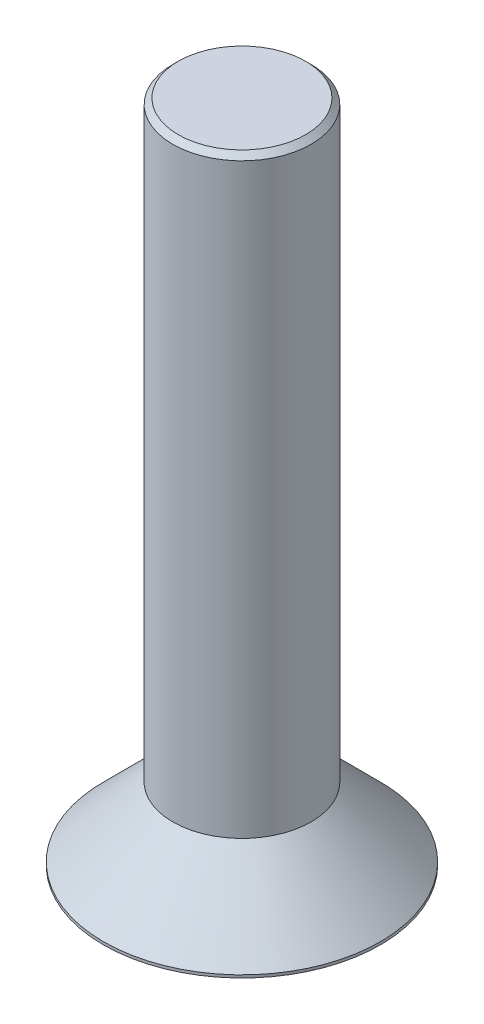
ISO-10303-21;
HEADER;
FILE_DESCRIPTION(('STEP AP214'),'2;1');
FILE_NAME('part.step','',(''),(''),'','','');
FILE_SCHEMA(('AUTOMOTIVE_DESIGN { 1 0 10303 214 1 1 1 1 }'));
ENDSEC;
DATA;
#1=APPLICATION_CONTEXT('core data for automotive mechanical design processes');
#2=APPLICATION_PROTOCOL_DEFINITION('international standard','automotive_design',2000,#1);
#3=PRODUCT_CONTEXT('',#1,'mechanical');
#4=PRODUCT('Part','Part','',(#3));
#5=PRODUCT_RELATED_PRODUCT_CATEGORY('part','',(#4));
#6=PRODUCT_DEFINITION_FORMATION('','',#4);
#7=PRODUCT_DEFINITION_CONTEXT('part definition',#1,'design');
#8=PRODUCT_DEFINITION('design','',#6,#7);
#9=PRODUCT_DEFINITION_SHAPE('','',#8);
#10=(LENGTH_UNIT() NAMED_UNIT(*) SI_UNIT(.MILLI.,.METRE.));
#11=(NAMED_UNIT(*) PLANE_ANGLE_UNIT() SI_UNIT($,.RADIAN.));
#12=(NAMED_UNIT(*) SI_UNIT($,.STERADIAN.) SOLID_ANGLE_UNIT());
#13=UNCERTAINTY_MEASURE_WITH_UNIT(LENGTH_MEASURE(1.E-05),#10,'distance_accuracy_value','');
#14=(GEOMETRIC_REPRESENTATION_CONTEXT(3) GLOBAL_UNCERTAINTY_ASSIGNED_CONTEXT((#13)) GLOBAL_UNIT_ASSIGNED_CONTEXT((#10,
#11,#12)) REPRESENTATION_CONTEXT('',''));
#15=CARTESIAN_POINT('',(0.,0.,0.));
#16=DIRECTION('',(0.,0.,1.));
#17=DIRECTION('',(1.,0.,0.));
#18=AXIS2_PLACEMENT_3D('',#15,#16,#17);
#19=CARTESIAN_POINT('',(0.,2.6,0.));
#20=DIRECTION('',(0.,-1.,0.));
#21=DIRECTION('',(0.,0.,-1.));
#22=AXIS2_PLACEMENT_3D('',#19,#20,#21);
#23=CYLINDRICAL_SURFACE('',#22,5.);
#24=CARTESIAN_POINT('',(0.,0.0999999999999916,0.));
#25=DIRECTION('',(0.,1.,0.));
#26=DIRECTION('',(0.,0.,1.));
#27=AXIS2_PLACEMENT_3D('',#24,#25,#26);
#28=CIRCLE('',#27,5.);
#29=CARTESIAN_POINT('',(0.,0.0999999999999916,5.));
#30=VERTEX_POINT('',#29);
#31=EDGE_CURVE('E151',#30,#30,#28,.F.);
#32=ORIENTED_EDGE('',*,*,#31,.T.);
#33=EDGE_LOOP('',(#32));
#34=FACE_BOUND('',#33,.T.);
#35=CARTESIAN_POINT('',(0.,0.,0.));
#36=DIRECTION('',(0.,1.,0.));
#37=DIRECTION('',(0.,0.,1.));
#38=AXIS2_PLACEMENT_3D('',#35,#36,#37);
#39=CIRCLE('',#38,5.);
#40=CARTESIAN_POINT('',(0.,0.,5.));
#41=VERTEX_POINT('',#40);
#42=EDGE_CURVE('E140',#41,#41,#39,.T.);
#43=ORIENTED_EDGE('',*,*,#42,.T.);
#44=EDGE_LOOP('',(#43));
#45=FACE_BOUND('',#44,.T.);
#46=ADVANCED_FACE('F37',(#34,#45),#23,.T.);
#47=CARTESIAN_POINT('',(0.,0.,0.));
#48=DIRECTION('',(0.,1.,0.));
#49=DIRECTION('',(0.,0.,1.));
#50=AXIS2_PLACEMENT_3D('',#47,#48,#49);
#51=PLANE('',#50);
#52=DIRECTION('',(0.,0.,1.));
#53=VECTOR('',#52,1.);
#54=CARTESIAN_POINT('',(1.54,0.,-0.889119414552024));
#55=LINE('',#54,#53);
#56=CARTESIAN_POINT('',(1.54,0.,-0.889119414552024));
#57=VERTEX_POINT('',#56);
#58=CARTESIAN_POINT('',(1.54,0.,0.889119414552024));
#59=VERTEX_POINT('',#58);
#60=EDGE_CURVE('E127',#57,#59,#55,.T.);
#61=ORIENTED_EDGE('',*,*,#60,.F.);
#62=DIRECTION('',(0.866025403784439,0.,0.5));
#63=VECTOR('',#62,1.);
#64=CARTESIAN_POINT('',(0.,0.,-1.77823882910405));
#65=LINE('',#64,#63);
#66=CARTESIAN_POINT('',(0.,0.,-1.77823882910405));
#67=VERTEX_POINT('',#66);
#68=EDGE_CURVE('E53',#67,#57,#65,.T.);
#69=ORIENTED_EDGE('',*,*,#68,.F.);
#70=DIRECTION('',(0.866025403784438,0.,-0.5));
#71=VECTOR('',#70,1.);
#72=CARTESIAN_POINT('',(-1.54,0.,-0.889119414552024));
#73=LINE('',#72,#71);
#74=CARTESIAN_POINT('',(-1.54,0.,-0.889119414552024));
#75=VERTEX_POINT('',#74);
#76=EDGE_CURVE('E136',#75,#67,#73,.T.);
#77=ORIENTED_EDGE('',*,*,#76,.F.);
#78=DIRECTION('',(0.,0.,-1.));
#79=VECTOR('',#78,1.);
#80=CARTESIAN_POINT('',(-1.54,0.,0.889119414552024));
#81=LINE('',#80,#79);
#82=CARTESIAN_POINT('',(-1.54,0.,0.889119414552024));
#83=VERTEX_POINT('',#82);
#84=EDGE_CURVE('E134',#83,#75,#81,.T.);
#85=ORIENTED_EDGE('',*,*,#84,.F.);
#86=DIRECTION('',(-0.866025403784439,0.,-0.5));
#87=VECTOR('',#86,1.);
#88=CARTESIAN_POINT('',(0.,0.,1.77823882910405));
#89=LINE('',#88,#87);
#90=CARTESIAN_POINT('',(0.,0.,1.77823882910405));
#91=VERTEX_POINT('',#90);
#92=EDGE_CURVE('E101',#91,#83,#89,.T.);
#93=ORIENTED_EDGE('',*,*,#92,.F.);
#94=DIRECTION('',(-0.866025403784439,0.,0.5));
#95=VECTOR('',#94,1.);
#96=CARTESIAN_POINT('',(1.54,0.,0.889119414552024));
#97=LINE('',#96,#95);
#98=EDGE_CURVE('E130',#59,#91,#97,.T.);
#99=ORIENTED_EDGE('',*,*,#98,.F.);
#100=EDGE_LOOP('',(#61,#69,#77,#85,#93,#99));
#101=FACE_BOUND('',#100,.T.);
#102=ORIENTED_EDGE('',*,*,#42,.F.);
#103=EDGE_LOOP('',(#102));
#104=FACE_BOUND('',#103,.T.);
#105=ADVANCED_FACE('F167',(#101,#104),#51,.F.);
#106=CARTESIAN_POINT('',(0.,2.6,0.));
#107=DIRECTION('',(0.,-1.,0.));
#108=DIRECTION('',(0.,0.,-1.));
#109=AXIS2_PLACEMENT_3D('',#106,#107,#108);
#110=CONICAL_SURFACE('',#109,2.5,0.785398163397447);
#111=ORIENTED_EDGE('',*,*,#31,.F.);
#112=EDGE_LOOP('',(#111));
#113=FACE_BOUND('',#112,.T.);
#114=CARTESIAN_POINT('',(0.,2.6,0.));
#115=DIRECTION('',(0.,1.,0.));
#116=DIRECTION('',(0.,0.,1.));
#117=AXIS2_PLACEMENT_3D('',#114,#115,#116);
#118=CIRCLE('',#117,2.5);
#119=CARTESIAN_POINT('',(0.,2.6,2.5));
#120=VERTEX_POINT('',#119);
#121=EDGE_CURVE('E148',#120,#120,#118,.T.);
#122=ORIENTED_EDGE('',*,*,#121,.F.);
#123=EDGE_LOOP('',(#122));
#124=FACE_BOUND('',#123,.T.);
#125=ADVANCED_FACE('F173',(#113,#124),#110,.T.);
#126=CARTESIAN_POINT('',(0.,0.95,-1.77823882910405));
#127=DIRECTION('',(0.5,0.,-0.866025403784439));
#128=DIRECTION('',(-0.866025403784439,0.,-0.5));
#129=AXIS2_PLACEMENT_3D('',#126,#127,#128);
#130=PLANE('',#129);
#131=ORIENTED_EDGE('',*,*,#68,.T.);
#132=DIRECTION('',(0.,-1.,0.));
#133=VECTOR('',#132,1.);
#134=CARTESIAN_POINT('',(1.54,0.95,-0.889119414552024));
#135=LINE('',#134,#133);
#136=CARTESIAN_POINT('',(1.54,0.95,-0.889119414552024));
#137=VERTEX_POINT('',#136);
#138=EDGE_CURVE('E83',#137,#57,#135,.T.);
#139=ORIENTED_EDGE('',*,*,#138,.F.);
#140=DIRECTION('',(0.866025403784439,0.,0.5));
#141=VECTOR('',#140,1.);
#142=CARTESIAN_POINT('',(0.,0.95,-1.77823882910405));
#143=LINE('',#142,#141);
#144=CARTESIAN_POINT('',(0.,0.95,-1.77823882910405));
#145=VERTEX_POINT('',#144);
#146=EDGE_CURVE('E138',#145,#137,#143,.T.);
#147=ORIENTED_EDGE('',*,*,#146,.F.);
#148=DIRECTION('',(0.,-1.,0.));
#149=VECTOR('',#148,1.);
#150=CARTESIAN_POINT('',(0.,0.95,-1.77823882910405));
#151=LINE('',#150,#149);
#152=EDGE_CURVE('E61',#145,#67,#151,.T.);
#153=ORIENTED_EDGE('',*,*,#152,.T.);
#154=EDGE_LOOP('',(#131,#139,#147,#153));
#155=FACE_BOUND('',#154,.T.);
#156=ADVANCED_FACE('F182',(#155),#130,.F.);
#157=CARTESIAN_POINT('',(-1.54,0.95,-0.889119414552024));
#158=DIRECTION('',(-0.5,0.,-0.866025403784439));
#159=DIRECTION('',(-0.866025403784439,0.,0.5));
#160=AXIS2_PLACEMENT_3D('',#157,#158,#159);
#161=PLANE('',#160);
#162=ORIENTED_EDGE('',*,*,#76,.T.);
#163=ORIENTED_EDGE('',*,*,#152,.F.);
#164=DIRECTION('',(0.866025403784438,0.,-0.5));
#165=VECTOR('',#164,1.);
#166=CARTESIAN_POINT('',(-1.54,0.95,-0.889119414552024));
#167=LINE('',#166,#165);
#168=CARTESIAN_POINT('',(-1.54,0.95,-0.889119414552024));
#169=VERTEX_POINT('',#168);
#170=EDGE_CURVE('E113',#169,#145,#167,.T.);
#171=ORIENTED_EDGE('',*,*,#170,.F.);
#172=DIRECTION('',(0.,-1.,0.));
#173=VECTOR('',#172,1.);
#174=CARTESIAN_POINT('',(-1.54,0.95,-0.889119414552024));
#175=LINE('',#174,#173);
#176=EDGE_CURVE('E105',#169,#75,#175,.T.);
#177=ORIENTED_EDGE('',*,*,#176,.T.);
#178=EDGE_LOOP('',(#162,#163,#171,#177));
#179=FACE_BOUND('',#178,.T.);
#180=ADVANCED_FACE('F187',(#179),#161,.F.);
#181=CARTESIAN_POINT('',(-1.54,0.95,0.889119414552024));
#182=DIRECTION('',(-1.,0.,0.));
#183=DIRECTION('',(0.,0.,1.));
#184=AXIS2_PLACEMENT_3D('',#181,#182,#183);
#185=PLANE('',#184);
#186=ORIENTED_EDGE('',*,*,#84,.T.);
#187=ORIENTED_EDGE('',*,*,#176,.F.);
#188=DIRECTION('',(0.,0.,-1.));
#189=VECTOR('',#188,1.);
#190=CARTESIAN_POINT('',(-1.54,0.95,0.889119414552024));
#191=LINE('',#190,#189);
#192=CARTESIAN_POINT('',(-1.54,0.95,0.889119414552024));
#193=VERTEX_POINT('',#192);
#194=EDGE_CURVE('E109',#193,#169,#191,.T.);
#195=ORIENTED_EDGE('',*,*,#194,.F.);
#196=DIRECTION('',(0.,-1.,0.));
#197=VECTOR('',#196,1.);
#198=CARTESIAN_POINT('',(-1.54,0.95,0.889119414552024));
#199=LINE('',#198,#197);
#200=EDGE_CURVE('E94',#193,#83,#199,.T.);
#201=ORIENTED_EDGE('',*,*,#200,.T.);
#202=EDGE_LOOP('',(#186,#187,#195,#201));
#203=FACE_BOUND('',#202,.T.);
#204=ADVANCED_FACE('F110',(#203),#185,.F.);
#205=CARTESIAN_POINT('',(0.,0.95,1.77823882910405));
#206=DIRECTION('',(-0.5,0.,0.866025403784439));
#207=DIRECTION('',(0.866025403784439,0.,0.5));
#208=AXIS2_PLACEMENT_3D('',#205,#206,#207);
#209=PLANE('',#208);
#210=ORIENTED_EDGE('',*,*,#92,.T.);
#211=ORIENTED_EDGE('',*,*,#200,.F.);
#212=DIRECTION('',(-0.866025403784439,0.,-0.5));
#213=VECTOR('',#212,1.);
#214=CARTESIAN_POINT('',(0.,0.95,1.77823882910405));
#215=LINE('',#214,#213);
#216=CARTESIAN_POINT('',(0.,0.95,1.77823882910405));
#217=VERTEX_POINT('',#216);
#218=EDGE_CURVE('E98',#217,#193,#215,.T.);
#219=ORIENTED_EDGE('',*,*,#218,.F.);
#220=DIRECTION('',(0.,-1.,0.));
#221=VECTOR('',#220,1.);
#222=CARTESIAN_POINT('',(0.,0.95,1.77823882910405));
#223=LINE('',#222,#221);
#224=EDGE_CURVE('E106',#217,#91,#223,.T.);
#225=ORIENTED_EDGE('',*,*,#224,.T.);
#226=EDGE_LOOP('',(#210,#211,#219,#225));
#227=FACE_BOUND('',#226,.T.);
#228=ADVANCED_FACE('F96',(#227),#209,.F.);
#229=CARTESIAN_POINT('',(1.54,0.95,0.889119414552024));
#230=DIRECTION('',(0.5,0.,0.866025403784439));
#231=DIRECTION('',(0.866025403784439,0.,-0.5));
#232=AXIS2_PLACEMENT_3D('',#229,#230,#231);
#233=PLANE('',#232);
#234=ORIENTED_EDGE('',*,*,#98,.T.);
#235=ORIENTED_EDGE('',*,*,#224,.F.);
#236=DIRECTION('',(-0.866025403784439,0.,0.5));
#237=VECTOR('',#236,1.);
#238=CARTESIAN_POINT('',(1.54,0.95,0.889119414552024));
#239=LINE('',#238,#237);
#240=CARTESIAN_POINT('',(1.54,0.95,0.889119414552024));
#241=VERTEX_POINT('',#240);
#242=EDGE_CURVE('E119',#241,#217,#239,.T.);
#243=ORIENTED_EDGE('',*,*,#242,.F.);
#244=DIRECTION('',(0.,-1.,0.));
#245=VECTOR('',#244,1.);
#246=CARTESIAN_POINT('',(1.54,0.95,0.889119414552024));
#247=LINE('',#246,#245);
#248=EDGE_CURVE('E143',#241,#59,#247,.T.);
#249=ORIENTED_EDGE('',*,*,#248,.T.);
#250=EDGE_LOOP('',(#234,#235,#243,#249));
#251=FACE_BOUND('',#250,.T.);
#252=ADVANCED_FACE('F207',(#251),#233,.F.);
#253=CARTESIAN_POINT('',(1.54,0.95,-0.889119414552024));
#254=DIRECTION('',(1.,0.,0.));
#255=DIRECTION('',(0.,0.,-1.));
#256=AXIS2_PLACEMENT_3D('',#253,#254,#255);
#257=PLANE('',#256);
#258=ORIENTED_EDGE('',*,*,#60,.T.);
#259=ORIENTED_EDGE('',*,*,#248,.F.);
#260=DIRECTION('',(0.,0.,1.));
#261=VECTOR('',#260,1.);
#262=CARTESIAN_POINT('',(1.54,0.95,-0.889119414552024));
#263=LINE('',#262,#261);
#264=EDGE_CURVE('E121',#137,#241,#263,.T.);
#265=ORIENTED_EDGE('',*,*,#264,.F.);
#266=ORIENTED_EDGE('',*,*,#138,.T.);
#267=EDGE_LOOP('',(#258,#259,#265,#266));
#268=FACE_BOUND('',#267,.T.);
#269=ADVANCED_FACE('F198',(#268),#257,.F.);
#270=CARTESIAN_POINT('',(0.,0.95,0.));
#271=DIRECTION('',(0.,-1.,0.));
#272=DIRECTION('',(0.,0.,-1.));
#273=AXIS2_PLACEMENT_3D('',#270,#271,#272);
#274=PLANE('',#273);
#275=ORIENTED_EDGE('',*,*,#146,.T.);
#276=ORIENTED_EDGE('',*,*,#264,.T.);
#277=ORIENTED_EDGE('',*,*,#242,.T.);
#278=ORIENTED_EDGE('',*,*,#218,.T.);
#279=ORIENTED_EDGE('',*,*,#194,.T.);
#280=ORIENTED_EDGE('',*,*,#170,.T.);
#281=EDGE_LOOP('',(#275,#276,#277,#278,#279,#280));
#282=FACE_BOUND('',#281,.T.);
#283=ADVANCED_FACE('F116',(#282),#274,.T.);
#284=CARTESIAN_POINT('',(0.,24.,0.));
#285=DIRECTION('',(0.,-1.,0.));
#286=DIRECTION('',(0.,0.,-1.));
#287=AXIS2_PLACEMENT_3D('',#284,#285,#286);
#288=CYLINDRICAL_SURFACE('',#287,2.5);
#289=CARTESIAN_POINT('',(0.,23.8,0.));
#290=DIRECTION('',(0.,1.,0.));
#291=DIRECTION('',(0.,0.,1.));
#292=AXIS2_PLACEMENT_3D('',#289,#290,#291);
#293=CIRCLE('',#292,2.5);
#294=CARTESIAN_POINT('',(0.,23.8,2.5));
#295=VERTEX_POINT('',#294);
#296=EDGE_CURVE('E11',#295,#295,#293,.F.);
#297=ORIENTED_EDGE('',*,*,#296,.T.);
#298=EDGE_LOOP('',(#297));
#299=FACE_BOUND('',#298,.T.);
#300=ORIENTED_EDGE('',*,*,#121,.T.);
#301=EDGE_LOOP('',(#300));
#302=FACE_BOUND('',#301,.T.);
#303=ADVANCED_FACE('F163',(#299,#302),#288,.T.);
#304=CARTESIAN_POINT('',(0.,24.,0.));
#305=DIRECTION('',(0.,1.,0.));
#306=DIRECTION('',(0.,0.,1.));
#307=AXIS2_PLACEMENT_3D('',#304,#305,#306);
#308=PLANE('',#307);
#309=CARTESIAN_POINT('',(0.,24.,0.));
#310=DIRECTION('',(0.,1.,0.));
#311=DIRECTION('',(0.,0.,1.));
#312=AXIS2_PLACEMENT_3D('',#309,#310,#311);
#313=CIRCLE('',#312,2.30000000000001);
#314=CARTESIAN_POINT('',(0.,24.,2.30000000000001));
#315=VERTEX_POINT('',#314);
#316=EDGE_CURVE('E46',#315,#315,#313,.T.);
#317=ORIENTED_EDGE('',*,*,#316,.T.);
#318=EDGE_LOOP('',(#317));
#319=FACE_BOUND('',#318,.T.);
#320=ADVANCED_FACE('F156',(#319),#308,.T.);
#321=CARTESIAN_POINT('',(0.,24.,0.));
#322=DIRECTION('',(0.,-1.,0.));
#323=DIRECTION('',(0.,0.,-1.));
#324=AXIS2_PLACEMENT_3D('',#321,#322,#323);
#325=CONICAL_SURFACE('',#324,2.30000000000001,0.785398163397443);
#326=ORIENTED_EDGE('',*,*,#296,.F.);
#327=EDGE_LOOP('',(#326));
#328=FACE_BOUND('',#327,.T.);
#329=ORIENTED_EDGE('',*,*,#316,.F.);
#330=EDGE_LOOP('',(#329));
#331=FACE_BOUND('',#330,.T.);
#332=ADVANCED_FACE('F40',(#328,#331),#325,.T.);
#333=CLOSED_SHELL('',(#46,#105,#125,#156,#180,#204,#228,#252,#269,#283,#303,#320,#332));
#334=MANIFOLD_SOLID_BREP('B2',#333);
#335=ADVANCED_BREP_SHAPE_REPRESENTATION('',(#18,#334),#14);
#336=SHAPE_DEFINITION_REPRESENTATION(#9,#335);
ENDSEC;
END-ISO-10303-21;
